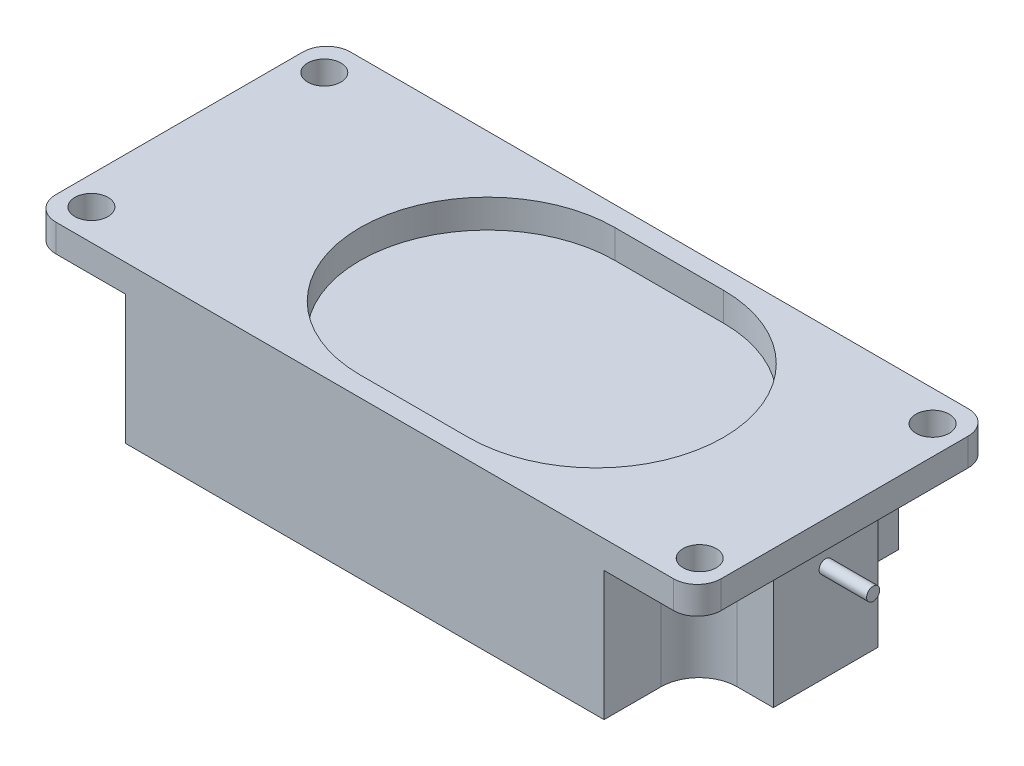
ISO-10303-21;
HEADER;
FILE_DESCRIPTION(('STEP AP214'),'2;1');
FILE_NAME('part.step','',(''),(''),'','','');
FILE_SCHEMA(('AUTOMOTIVE_DESIGN { 1 0 10303 214 1 1 1 1 }'));
ENDSEC;
DATA;
#1=APPLICATION_CONTEXT('core data for automotive mechanical design processes');
#2=APPLICATION_PROTOCOL_DEFINITION('international standard','automotive_design',2000,#1);
#3=PRODUCT_CONTEXT('',#1,'mechanical');
#4=PRODUCT('Part','Part','',(#3));
#5=PRODUCT_RELATED_PRODUCT_CATEGORY('part','',(#4));
#6=PRODUCT_DEFINITION_FORMATION('','',#4);
#7=PRODUCT_DEFINITION_CONTEXT('part definition',#1,'design');
#8=PRODUCT_DEFINITION('design','',#6,#7);
#9=PRODUCT_DEFINITION_SHAPE('','',#8);
#10=(LENGTH_UNIT() NAMED_UNIT(*) SI_UNIT(.MILLI.,.METRE.));
#11=(NAMED_UNIT(*) PLANE_ANGLE_UNIT() SI_UNIT($,.RADIAN.));
#12=(NAMED_UNIT(*) SI_UNIT($,.STERADIAN.) SOLID_ANGLE_UNIT());
#13=UNCERTAINTY_MEASURE_WITH_UNIT(LENGTH_MEASURE(1.E-05),#10,'distance_accuracy_value','');
#14=(GEOMETRIC_REPRESENTATION_CONTEXT(3) GLOBAL_UNCERTAINTY_ASSIGNED_CONTEXT((#13)) GLOBAL_UNIT_ASSIGNED_CONTEXT((#10,
#11,#12)) REPRESENTATION_CONTEXT('',''));
#15=CARTESIAN_POINT('',(0.,0.,0.));
#16=DIRECTION('',(0.,0.,1.));
#17=DIRECTION('',(1.,0.,0.));
#18=AXIS2_PLACEMENT_3D('',#15,#16,#17);
#19=CARTESIAN_POINT('',(0.,0.,0.));
#20=DIRECTION('',(0.,-1.,0.));
#21=DIRECTION('',(0.,0.,-1.));
#22=AXIS2_PLACEMENT_3D('',#19,#20,#21);
#23=PLANE('',#22);
#24=DIRECTION('',(1.,0.,0.));
#25=VECTOR('',#24,1.);
#26=CARTESIAN_POINT('',(25.185,0.,-5.5));
#27=LINE('',#26,#25);
#28=CARTESIAN_POINT('',(29.185,0.,-5.5));
#29=VERTEX_POINT('',#28);
#30=CARTESIAN_POINT('',(33.,0.,-5.5));
#31=VERTEX_POINT('',#30);
#32=EDGE_CURVE('E307',#29,#31,#27,.T.);
#33=ORIENTED_EDGE('',*,*,#32,.F.);
#34=CARTESIAN_POINT('',(29.185,0.,-9.5));
#35=DIRECTION('',(0.,-1.,0.));
#36=DIRECTION('',(0.,0.,-1.));
#37=AXIS2_PLACEMENT_3D('',#34,#35,#36);
#38=CIRCLE('',#37,4.);
#39=CARTESIAN_POINT('',(25.185,0.,-9.5));
#40=VERTEX_POINT('',#39);
#41=EDGE_CURVE('E443',#29,#40,#38,.T.);
#42=ORIENTED_EDGE('',*,*,#41,.T.);
#43=DIRECTION('',(0.,0.,1.));
#44=VECTOR('',#43,1.);
#45=CARTESIAN_POINT('',(25.185,0.,-15.5));
#46=LINE('',#45,#44);
#47=CARTESIAN_POINT('',(25.185,0.,-15.5));
#48=VERTEX_POINT('',#47);
#49=EDGE_CURVE('E304',#48,#40,#46,.T.);
#50=ORIENTED_EDGE('',*,*,#49,.F.);
#51=DIRECTION('',(-1.,0.,0.));
#52=VECTOR('',#51,1.);
#53=CARTESIAN_POINT('',(35.,0.,-15.5));
#54=LINE('',#53,#52);
#55=CARTESIAN_POINT('',(32.5,0.,-15.5));
#56=VERTEX_POINT('',#55);
#57=EDGE_CURVE('E365',#56,#48,#54,.T.);
#58=ORIENTED_EDGE('',*,*,#57,.F.);
#59=CARTESIAN_POINT('',(32.5,0.,-13.));
#60=DIRECTION('',(0.,-1.,0.));
#61=DIRECTION('',(0.,0.,-1.));
#62=AXIS2_PLACEMENT_3D('',#59,#60,#61);
#63=CIRCLE('',#62,2.5);
#64=CARTESIAN_POINT('',(35.,0.,-13.));
#65=VERTEX_POINT('',#64);
#66=EDGE_CURVE('E396',#56,#65,#63,.T.);
#67=ORIENTED_EDGE('',*,*,#66,.T.);
#68=DIRECTION('',(0.,0.,-1.));
#69=VECTOR('',#68,1.);
#70=CARTESIAN_POINT('',(35.,0.,-15.5));
#71=LINE('',#70,#69);
#72=CARTESIAN_POINT('',(35.,0.,13.));
#73=VERTEX_POINT('',#72);
#74=EDGE_CURVE('E381',#73,#65,#71,.T.);
#75=ORIENTED_EDGE('',*,*,#74,.F.);
#76=CARTESIAN_POINT('',(32.5,0.,13.));
#77=DIRECTION('',(0.,-1.,0.));
#78=DIRECTION('',(0.,0.,-1.));
#79=AXIS2_PLACEMENT_3D('',#76,#77,#78);
#80=CIRCLE('',#79,2.5);
#81=CARTESIAN_POINT('',(32.5,0.,15.5));
#82=VERTEX_POINT('',#81);
#83=EDGE_CURVE('E393',#73,#82,#80,.T.);
#84=ORIENTED_EDGE('',*,*,#83,.T.);
#85=DIRECTION('',(1.,0.,0.));
#86=VECTOR('',#85,1.);
#87=CARTESIAN_POINT('',(35.,0.,15.5));
#88=LINE('',#87,#86);
#89=CARTESIAN_POINT('',(25.185,0.,15.5));
#90=VERTEX_POINT('',#89);
#91=EDGE_CURVE('E377',#90,#82,#88,.T.);
#92=ORIENTED_EDGE('',*,*,#91,.F.);
#93=DIRECTION('',(0.,0.,1.));
#94=VECTOR('',#93,1.);
#95=CARTESIAN_POINT('',(25.185,0.,5.5));
#96=LINE('',#95,#94);
#97=CARTESIAN_POINT('',(25.185,0.,9.5));
#98=VERTEX_POINT('',#97);
#99=EDGE_CURVE('E257',#98,#90,#96,.T.);
#100=ORIENTED_EDGE('',*,*,#99,.F.);
#101=CARTESIAN_POINT('',(29.185,0.,9.5));
#102=DIRECTION('',(0.,-1.,0.));
#103=DIRECTION('',(0.,0.,-1.));
#104=AXIS2_PLACEMENT_3D('',#101,#102,#103);
#105=CIRCLE('',#104,4.);
#106=CARTESIAN_POINT('',(29.185,0.,5.5));
#107=VERTEX_POINT('',#106);
#108=EDGE_CURVE('E441',#98,#107,#105,.T.);
#109=ORIENTED_EDGE('',*,*,#108,.T.);
#110=DIRECTION('',(-1.,0.,0.));
#111=VECTOR('',#110,1.);
#112=CARTESIAN_POINT('',(25.185,0.,5.5));
#113=LINE('',#112,#111);
#114=CARTESIAN_POINT('',(33.,0.,5.5));
#115=VERTEX_POINT('',#114);
#116=EDGE_CURVE('E264',#115,#107,#113,.T.);
#117=ORIENTED_EDGE('',*,*,#116,.F.);
#118=DIRECTION('',(0.,0.,1.));
#119=VECTOR('',#118,1.);
#120=CARTESIAN_POINT('',(33.,0.,-5.5));
#121=LINE('',#120,#119);
#122=EDGE_CURVE('E309',#31,#115,#121,.T.);
#123=ORIENTED_EDGE('',*,*,#122,.F.);
#124=EDGE_LOOP('',(#33,#42,#50,#58,#67,#75,#84,#92,#100,#109,#117,#123));
#125=FACE_BOUND('',#124,.T.);
#126=CARTESIAN_POINT('',(32.,0.,-12.25));
#127=DIRECTION('',(0.,1.,0.));
#128=DIRECTION('',(0.,0.,1.));
#129=AXIS2_PLACEMENT_3D('',#126,#127,#128);
#130=CIRCLE('',#129,1.75);
#131=CARTESIAN_POINT('',(32.,0.,-10.5));
#132=VERTEX_POINT('',#131);
#133=EDGE_CURVE('E336',#132,#132,#130,.T.);
#134=ORIENTED_EDGE('',*,*,#133,.T.);
#135=EDGE_LOOP('',(#134));
#136=FACE_BOUND('',#135,.T.);
#137=CARTESIAN_POINT('',(32.,0.,12.25));
#138=DIRECTION('',(0.,1.,0.));
#139=DIRECTION('',(0.,0.,1.));
#140=AXIS2_PLACEMENT_3D('',#137,#138,#139);
#141=CIRCLE('',#140,1.75);
#142=CARTESIAN_POINT('',(32.,0.,14.));
#143=VERTEX_POINT('',#142);
#144=EDGE_CURVE('E340',#143,#143,#141,.T.);
#145=ORIENTED_EDGE('',*,*,#144,.T.);
#146=EDGE_LOOP('',(#145));
#147=FACE_BOUND('',#146,.T.);
#148=ADVANCED_FACE('F33',(#125,#136,#147),#23,.T.);
#149=CARTESIAN_POINT('',(0.,2.9,0.));
#150=DIRECTION('',(0.,-1.,0.));
#151=DIRECTION('',(0.,0.,-1.));
#152=AXIS2_PLACEMENT_3D('',#149,#150,#151);
#153=PLANE('',#152);
#154=DIRECTION('',(1.,0.,0.));
#155=VECTOR('',#154,1.);
#156=CARTESIAN_POINT('',(-2.575,2.9,13.415));
#157=LINE('',#156,#155);
#158=CARTESIAN_POINT('',(-2.575,2.9,13.415));
#159=VERTEX_POINT('',#158);
#160=CARTESIAN_POINT('',(8.83500000000001,2.9,13.415));
#161=VERTEX_POINT('',#160);
#162=EDGE_CURVE('E251',#159,#161,#157,.T.);
#163=ORIENTED_EDGE('',*,*,#162,.F.);
#164=CARTESIAN_POINT('',(-2.575,2.9,0.));
#165=DIRECTION('',(0.,1.,0.));
#166=DIRECTION('',(0.,0.,1.));
#167=AXIS2_PLACEMENT_3D('',#164,#165,#166);
#168=CIRCLE('',#167,13.415);
#169=CARTESIAN_POINT('',(-2.575,2.9,-13.415));
#170=VERTEX_POINT('',#169);
#171=EDGE_CURVE('E48',#170,#159,#168,.T.);
#172=ORIENTED_EDGE('',*,*,#171,.F.);
#173=DIRECTION('',(-1.,0.,0.));
#174=VECTOR('',#173,1.);
#175=CARTESIAN_POINT('',(-2.575,2.9,-13.415));
#176=LINE('',#175,#174);
#177=CARTESIAN_POINT('',(8.83500000000001,2.9,-13.415));
#178=VERTEX_POINT('',#177);
#179=EDGE_CURVE('E240',#178,#170,#176,.T.);
#180=ORIENTED_EDGE('',*,*,#179,.F.);
#181=CARTESIAN_POINT('',(8.83500000000001,2.9,0.));
#182=DIRECTION('',(0.,1.,0.));
#183=DIRECTION('',(0.,0.,1.));
#184=AXIS2_PLACEMENT_3D('',#181,#182,#183);
#185=CIRCLE('',#184,13.415);
#186=EDGE_CURVE('E243',#161,#178,#185,.T.);
#187=ORIENTED_EDGE('',*,*,#186,.F.);
#188=EDGE_LOOP('',(#163,#172,#180,#187));
#189=FACE_BOUND('',#188,.T.);
#190=DIRECTION('',(-1.,0.,0.));
#191=VECTOR('',#190,1.);
#192=CARTESIAN_POINT('',(35.,2.9,-15.5));
#193=LINE('',#192,#191);
#194=CARTESIAN_POINT('',(32.5,2.9,-15.5));
#195=VERTEX_POINT('',#194);
#196=CARTESIAN_POINT('',(-32.5,2.9,-15.5));
#197=VERTEX_POINT('',#196);
#198=EDGE_CURVE('E371',#195,#197,#193,.T.);
#199=ORIENTED_EDGE('',*,*,#198,.T.);
#200=CARTESIAN_POINT('',(-32.5,2.9,-13.));
#201=DIRECTION('',(0.,-1.,0.));
#202=DIRECTION('',(0.,0.,-1.));
#203=AXIS2_PLACEMENT_3D('',#200,#201,#202);
#204=CIRCLE('',#203,2.5);
#205=CARTESIAN_POINT('',(-35.,2.9,-13.));
#206=VERTEX_POINT('',#205);
#207=EDGE_CURVE('E412',#197,#206,#204,.F.);
#208=ORIENTED_EDGE('',*,*,#207,.T.);
#209=DIRECTION('',(0.,0.,1.));
#210=VECTOR('',#209,1.);
#211=CARTESIAN_POINT('',(-35.,2.9,-15.5));
#212=LINE('',#211,#210);
#213=CARTESIAN_POINT('',(-35.,2.9,13.));
#214=VERTEX_POINT('',#213);
#215=EDGE_CURVE('E361',#206,#214,#212,.T.);
#216=ORIENTED_EDGE('',*,*,#215,.T.);
#217=CARTESIAN_POINT('',(-32.5,2.9,13.));
#218=DIRECTION('',(0.,-1.,0.));
#219=DIRECTION('',(0.,0.,-1.));
#220=AXIS2_PLACEMENT_3D('',#217,#218,#219);
#221=CIRCLE('',#220,2.5);
#222=CARTESIAN_POINT('',(-32.5,2.9,15.5));
#223=VERTEX_POINT('',#222);
#224=EDGE_CURVE('E406',#214,#223,#221,.F.);
#225=ORIENTED_EDGE('',*,*,#224,.T.);
#226=DIRECTION('',(1.,0.,0.));
#227=VECTOR('',#226,1.);
#228=CARTESIAN_POINT('',(35.,2.9,15.5));
#229=LINE('',#228,#227);
#230=CARTESIAN_POINT('',(32.5,2.9,15.5));
#231=VERTEX_POINT('',#230);
#232=EDGE_CURVE('E364',#223,#231,#229,.T.);
#233=ORIENTED_EDGE('',*,*,#232,.T.);
#234=CARTESIAN_POINT('',(32.5,2.9,13.));
#235=DIRECTION('',(0.,-1.,0.));
#236=DIRECTION('',(0.,0.,-1.));
#237=AXIS2_PLACEMENT_3D('',#234,#235,#236);
#238=CIRCLE('',#237,2.5);
#239=CARTESIAN_POINT('',(35.,2.9,13.));
#240=VERTEX_POINT('',#239);
#241=EDGE_CURVE('E408',#231,#240,#238,.F.);
#242=ORIENTED_EDGE('',*,*,#241,.T.);
#243=DIRECTION('',(0.,0.,-1.));
#244=VECTOR('',#243,1.);
#245=CARTESIAN_POINT('',(35.,2.9,-15.5));
#246=LINE('',#245,#244);
#247=CARTESIAN_POINT('',(35.,2.9,-13.));
#248=VERTEX_POINT('',#247);
#249=EDGE_CURVE('E368',#240,#248,#246,.T.);
#250=ORIENTED_EDGE('',*,*,#249,.T.);
#251=CARTESIAN_POINT('',(32.5,2.9,-13.));
#252=DIRECTION('',(0.,-1.,0.));
#253=DIRECTION('',(0.,0.,-1.));
#254=AXIS2_PLACEMENT_3D('',#251,#252,#253);
#255=CIRCLE('',#254,2.5);
#256=EDGE_CURVE('E410',#248,#195,#255,.F.);
#257=ORIENTED_EDGE('',*,*,#256,.T.);
#258=EDGE_LOOP('',(#199,#208,#216,#225,#233,#242,#250,#257));
#259=FACE_BOUND('',#258,.T.);
#260=CARTESIAN_POINT('',(-32.,2.9,-12.25));
#261=DIRECTION('',(0.,1.,0.));
#262=DIRECTION('',(0.,0.,1.));
#263=AXIS2_PLACEMENT_3D('',#260,#261,#262);
#264=CIRCLE('',#263,1.75);
#265=CARTESIAN_POINT('',(-32.,2.9,-10.5));
#266=VERTEX_POINT('',#265);
#267=EDGE_CURVE('E355',#266,#266,#264,.T.);
#268=ORIENTED_EDGE('',*,*,#267,.F.);
#269=EDGE_LOOP('',(#268));
#270=FACE_BOUND('',#269,.T.);
#271=CARTESIAN_POINT('',(-32.,2.9,12.25));
#272=DIRECTION('',(0.,1.,0.));
#273=DIRECTION('',(0.,0.,1.));
#274=AXIS2_PLACEMENT_3D('',#271,#272,#273);
#275=CIRCLE('',#274,1.75);
#276=CARTESIAN_POINT('',(-32.,2.9,14.));
#277=VERTEX_POINT('',#276);
#278=EDGE_CURVE('E349',#277,#277,#275,.T.);
#279=ORIENTED_EDGE('',*,*,#278,.F.);
#280=EDGE_LOOP('',(#279));
#281=FACE_BOUND('',#280,.T.);
#282=CARTESIAN_POINT('',(32.,2.9,12.25));
#283=DIRECTION('',(0.,1.,0.));
#284=DIRECTION('',(0.,0.,1.));
#285=AXIS2_PLACEMENT_3D('',#282,#283,#284);
#286=CIRCLE('',#285,1.75);
#287=CARTESIAN_POINT('',(32.,2.9,14.));
#288=VERTEX_POINT('',#287);
#289=EDGE_CURVE('E343',#288,#288,#286,.T.);
#290=ORIENTED_EDGE('',*,*,#289,.F.);
#291=EDGE_LOOP('',(#290));
#292=FACE_BOUND('',#291,.T.);
#293=CARTESIAN_POINT('',(32.,2.9,-12.25));
#294=DIRECTION('',(0.,1.,0.));
#295=DIRECTION('',(0.,0.,1.));
#296=AXIS2_PLACEMENT_3D('',#293,#294,#295);
#297=CIRCLE('',#296,1.75);
#298=CARTESIAN_POINT('',(32.,2.9,-10.5));
#299=VERTEX_POINT('',#298);
#300=EDGE_CURVE('E337',#299,#299,#297,.T.);
#301=ORIENTED_EDGE('',*,*,#300,.F.);
#302=EDGE_LOOP('',(#301));
#303=FACE_BOUND('',#302,.T.);
#304=ADVANCED_FACE('F508',(#189,#259,#270,#281,#292,#303),#153,.F.);
#305=DIRECTION('',(-1.,0.,0.));
#306=VECTOR('',#305,1.);
#307=CARTESIAN_POINT('',(-33.,0.,5.5));
#308=LINE('',#307,#306);
#309=CARTESIAN_POINT('',(-29.185,0.,5.5));
#310=VERTEX_POINT('',#309);
#311=CARTESIAN_POINT('',(-33.,0.,5.5));
#312=VERTEX_POINT('',#311);
#313=EDGE_CURVE('E294',#310,#312,#308,.T.);
#314=ORIENTED_EDGE('',*,*,#313,.F.);
#315=CARTESIAN_POINT('',(-29.185,0.,9.5));
#316=DIRECTION('',(0.,-1.,0.));
#317=DIRECTION('',(0.,0.,-1.));
#318=AXIS2_PLACEMENT_3D('',#315,#316,#317);
#319=CIRCLE('',#318,4.);
#320=CARTESIAN_POINT('',(-25.185,0.,9.5));
#321=VERTEX_POINT('',#320);
#322=EDGE_CURVE('E429',#310,#321,#319,.T.);
#323=ORIENTED_EDGE('',*,*,#322,.T.);
#324=DIRECTION('',(0.,0.,-1.));
#325=VECTOR('',#324,1.);
#326=CARTESIAN_POINT('',(-25.185,0.,5.5));
#327=LINE('',#326,#325);
#328=CARTESIAN_POINT('',(-25.185,0.,15.5));
#329=VERTEX_POINT('',#328);
#330=EDGE_CURVE('E291',#329,#321,#327,.T.);
#331=ORIENTED_EDGE('',*,*,#330,.F.);
#332=CARTESIAN_POINT('',(-32.5,0.,15.5));
#333=VERTEX_POINT('',#332);
#334=EDGE_CURVE('E378',#333,#329,#88,.T.);
#335=ORIENTED_EDGE('',*,*,#334,.F.);
#336=CARTESIAN_POINT('',(-32.5,0.,13.));
#337=DIRECTION('',(0.,-1.,0.));
#338=DIRECTION('',(0.,0.,-1.));
#339=AXIS2_PLACEMENT_3D('',#336,#337,#338);
#340=CIRCLE('',#339,2.5);
#341=CARTESIAN_POINT('',(-35.,0.,13.));
#342=VERTEX_POINT('',#341);
#343=EDGE_CURVE('E391',#333,#342,#340,.T.);
#344=ORIENTED_EDGE('',*,*,#343,.T.);
#345=DIRECTION('',(0.,0.,1.));
#346=VECTOR('',#345,1.);
#347=CARTESIAN_POINT('',(-35.,0.,-15.5));
#348=LINE('',#347,#346);
#349=CARTESIAN_POINT('',(-35.,0.,-13.));
#350=VERTEX_POINT('',#349);
#351=EDGE_CURVE('E358',#350,#342,#348,.T.);
#352=ORIENTED_EDGE('',*,*,#351,.F.);
#353=CARTESIAN_POINT('',(-32.5,0.,-13.));
#354=DIRECTION('',(0.,-1.,0.));
#355=DIRECTION('',(0.,0.,-1.));
#356=AXIS2_PLACEMENT_3D('',#353,#354,#355);
#357=CIRCLE('',#356,2.5);
#358=CARTESIAN_POINT('',(-32.5,0.,-15.5));
#359=VERTEX_POINT('',#358);
#360=EDGE_CURVE('E398',#350,#359,#357,.T.);
#361=ORIENTED_EDGE('',*,*,#360,.T.);
#362=CARTESIAN_POINT('',(-25.185,0.,-15.5));
#363=VERTEX_POINT('',#362);
#364=EDGE_CURVE('E384',#363,#359,#54,.T.);
#365=ORIENTED_EDGE('',*,*,#364,.F.);
#366=DIRECTION('',(0.,0.,-1.));
#367=VECTOR('',#366,1.);
#368=CARTESIAN_POINT('',(-25.185,0.,-15.5));
#369=LINE('',#368,#367);
#370=CARTESIAN_POINT('',(-25.185,0.,-9.5));
#371=VERTEX_POINT('',#370);
#372=EDGE_CURVE('E302',#371,#363,#369,.T.);
#373=ORIENTED_EDGE('',*,*,#372,.F.);
#374=CARTESIAN_POINT('',(-29.185,0.,-9.5));
#375=DIRECTION('',(0.,-1.,0.));
#376=DIRECTION('',(0.,0.,-1.));
#377=AXIS2_PLACEMENT_3D('',#374,#375,#376);
#378=CIRCLE('',#377,4.);
#379=CARTESIAN_POINT('',(-29.185,0.,-5.5));
#380=VERTEX_POINT('',#379);
#381=EDGE_CURVE('E427',#371,#380,#378,.T.);
#382=ORIENTED_EDGE('',*,*,#381,.T.);
#383=DIRECTION('',(1.,0.,0.));
#384=VECTOR('',#383,1.);
#385=CARTESIAN_POINT('',(-33.,0.,-5.5));
#386=LINE('',#385,#384);
#387=CARTESIAN_POINT('',(-33.,0.,-5.5));
#388=VERTEX_POINT('',#387);
#389=EDGE_CURVE('E299',#388,#380,#386,.T.);
#390=ORIENTED_EDGE('',*,*,#389,.F.);
#391=DIRECTION('',(0.,0.,-1.));
#392=VECTOR('',#391,1.);
#393=CARTESIAN_POINT('',(-33.,0.,-5.5));
#394=LINE('',#393,#392);
#395=EDGE_CURVE('E296',#312,#388,#394,.T.);
#396=ORIENTED_EDGE('',*,*,#395,.F.);
#397=EDGE_LOOP('',(#314,#323,#331,#335,#344,#352,#361,#365,#373,#382,#390,#396));
#398=FACE_BOUND('',#397,.T.);
#399=CARTESIAN_POINT('',(-32.,0.,-12.25));
#400=DIRECTION('',(0.,1.,0.));
#401=DIRECTION('',(0.,0.,1.));
#402=AXIS2_PLACEMENT_3D('',#399,#400,#401);
#403=CIRCLE('',#402,1.75);
#404=CARTESIAN_POINT('',(-32.,0.,-10.5));
#405=VERTEX_POINT('',#404);
#406=EDGE_CURVE('E352',#405,#405,#403,.T.);
#407=ORIENTED_EDGE('',*,*,#406,.T.);
#408=EDGE_LOOP('',(#407));
#409=FACE_BOUND('',#408,.T.);
#410=CARTESIAN_POINT('',(-32.,0.,12.25));
#411=DIRECTION('',(0.,1.,0.));
#412=DIRECTION('',(0.,0.,1.));
#413=AXIS2_PLACEMENT_3D('',#410,#411,#412);
#414=CIRCLE('',#413,1.75);
#415=CARTESIAN_POINT('',(-32.,0.,14.));
#416=VERTEX_POINT('',#415);
#417=EDGE_CURVE('E346',#416,#416,#414,.T.);
#418=ORIENTED_EDGE('',*,*,#417,.T.);
#419=EDGE_LOOP('',(#418));
#420=FACE_BOUND('',#419,.T.);
#421=ADVANCED_FACE('F548',(#398,#409,#420),#23,.T.);
#422=CARTESIAN_POINT('',(-35.,2.9,-15.5));
#423=DIRECTION('',(1.,0.,0.));
#424=DIRECTION('',(0.,0.,-1.));
#425=AXIS2_PLACEMENT_3D('',#422,#423,#424);
#426=PLANE('',#425);
#427=ORIENTED_EDGE('',*,*,#215,.F.);
#428=DIRECTION('',(0.,-1.,0.));
#429=VECTOR('',#428,1.);
#430=CARTESIAN_POINT('',(-35.,2.9,-13.));
#431=LINE('',#430,#429);
#432=EDGE_CURVE('E388',#206,#350,#431,.T.);
#433=ORIENTED_EDGE('',*,*,#432,.T.);
#434=ORIENTED_EDGE('',*,*,#351,.T.);
#435=DIRECTION('',(0.,-1.,0.));
#436=VECTOR('',#435,1.);
#437=CARTESIAN_POINT('',(-35.,2.9,13.));
#438=LINE('',#437,#436);
#439=EDGE_CURVE('E374',#342,#214,#438,.F.);
#440=ORIENTED_EDGE('',*,*,#439,.T.);
#441=EDGE_LOOP('',(#427,#433,#434,#440));
#442=FACE_BOUND('',#441,.T.);
#443=ADVANCED_FACE('F519',(#442),#426,.F.);
#444=CARTESIAN_POINT('',(35.,2.9,15.5));
#445=DIRECTION('',(0.,0.,-1.));
#446=DIRECTION('',(-1.,0.,0.));
#447=AXIS2_PLACEMENT_3D('',#444,#445,#446);
#448=PLANE('',#447);
#449=ORIENTED_EDGE('',*,*,#334,.T.);
#450=DIRECTION('',(0.,1.,0.));
#451=VECTOR('',#450,1.);
#452=CARTESIAN_POINT('',(-25.185,-13.6,15.5));
#453=LINE('',#452,#451);
#454=CARTESIAN_POINT('',(-25.185,-13.6,15.5));
#455=VERTEX_POINT('',#454);
#456=EDGE_CURVE('E330',#455,#329,#453,.T.);
#457=ORIENTED_EDGE('',*,*,#456,.F.);
#458=DIRECTION('',(-1.,0.,0.));
#459=VECTOR('',#458,1.);
#460=CARTESIAN_POINT('',(-25.185,-13.6,15.5));
#461=LINE('',#460,#459);
#462=CARTESIAN_POINT('',(25.185,-13.6,15.5));
#463=VERTEX_POINT('',#462);
#464=EDGE_CURVE('E263',#463,#455,#461,.T.);
#465=ORIENTED_EDGE('',*,*,#464,.F.);
#466=DIRECTION('',(0.,1.,0.));
#467=VECTOR('',#466,1.);
#468=CARTESIAN_POINT('',(25.185,-13.6,15.5));
#469=LINE('',#468,#467);
#470=EDGE_CURVE('E333',#463,#90,#469,.T.);
#471=ORIENTED_EDGE('',*,*,#470,.T.);
#472=ORIENTED_EDGE('',*,*,#91,.T.);
#473=DIRECTION('',(0.,-1.,0.));
#474=VECTOR('',#473,1.);
#475=CARTESIAN_POINT('',(32.5,2.9,15.5));
#476=LINE('',#475,#474);
#477=EDGE_CURVE('E422',#82,#231,#476,.F.);
#478=ORIENTED_EDGE('',*,*,#477,.T.);
#479=ORIENTED_EDGE('',*,*,#232,.F.);
#480=DIRECTION('',(0.,-1.,0.));
#481=VECTOR('',#480,1.);
#482=CARTESIAN_POINT('',(-32.5,2.9,15.5));
#483=LINE('',#482,#481);
#484=EDGE_CURVE('E419',#223,#333,#483,.T.);
#485=ORIENTED_EDGE('',*,*,#484,.T.);
#486=EDGE_LOOP('',(#449,#457,#465,#471,#472,#478,#479,#485));
#487=FACE_BOUND('',#486,.T.);
#488=ADVANCED_FACE('F528',(#487),#448,.F.);
#489=CARTESIAN_POINT('',(35.,2.9,-15.5));
#490=DIRECTION('',(-1.,0.,0.));
#491=DIRECTION('',(0.,0.,1.));
#492=AXIS2_PLACEMENT_3D('',#489,#490,#491);
#493=PLANE('',#492);
#494=ORIENTED_EDGE('',*,*,#74,.T.);
#495=DIRECTION('',(0.,-1.,0.));
#496=VECTOR('',#495,1.);
#497=CARTESIAN_POINT('',(35.,2.9,-13.));
#498=LINE('',#497,#496);
#499=EDGE_CURVE('E417',#65,#248,#498,.F.);
#500=ORIENTED_EDGE('',*,*,#499,.T.);
#501=ORIENTED_EDGE('',*,*,#249,.F.);
#502=DIRECTION('',(0.,-1.,0.));
#503=VECTOR('',#502,1.);
#504=CARTESIAN_POINT('',(35.,2.9,13.));
#505=LINE('',#504,#503);
#506=EDGE_CURVE('E414',#240,#73,#505,.T.);
#507=ORIENTED_EDGE('',*,*,#506,.T.);
#508=EDGE_LOOP('',(#494,#500,#501,#507));
#509=FACE_BOUND('',#508,.T.);
#510=ADVANCED_FACE('F502',(#509),#493,.F.);
#511=CARTESIAN_POINT('',(35.,2.9,-15.5));
#512=DIRECTION('',(0.,0.,1.));
#513=DIRECTION('',(1.,0.,0.));
#514=AXIS2_PLACEMENT_3D('',#511,#512,#513);
#515=PLANE('',#514);
#516=ORIENTED_EDGE('',*,*,#57,.T.);
#517=DIRECTION('',(0.,1.,0.));
#518=VECTOR('',#517,1.);
#519=CARTESIAN_POINT('',(25.185,-13.6,-15.5));
#520=LINE('',#519,#518);
#521=CARTESIAN_POINT('',(25.185,-13.6,-15.5));
#522=VERTEX_POINT('',#521);
#523=EDGE_CURVE('E318',#522,#48,#520,.T.);
#524=ORIENTED_EDGE('',*,*,#523,.F.);
#525=DIRECTION('',(1.,0.,0.));
#526=VECTOR('',#525,1.);
#527=CARTESIAN_POINT('',(-25.185,-13.6,-15.5));
#528=LINE('',#527,#526);
#529=CARTESIAN_POINT('',(-25.185,-13.6,-15.5));
#530=VERTEX_POINT('',#529);
#531=EDGE_CURVE('E278',#530,#522,#528,.T.);
#532=ORIENTED_EDGE('',*,*,#531,.F.);
#533=DIRECTION('',(0.,1.,0.));
#534=VECTOR('',#533,1.);
#535=CARTESIAN_POINT('',(-25.185,-13.6,-15.5));
#536=LINE('',#535,#534);
#537=EDGE_CURVE('E321',#530,#363,#536,.T.);
#538=ORIENTED_EDGE('',*,*,#537,.T.);
#539=ORIENTED_EDGE('',*,*,#364,.T.);
#540=DIRECTION('',(0.,-1.,0.));
#541=VECTOR('',#540,1.);
#542=CARTESIAN_POINT('',(-32.5,2.9,-15.5));
#543=LINE('',#542,#541);
#544=EDGE_CURVE('E404',#359,#197,#543,.F.);
#545=ORIENTED_EDGE('',*,*,#544,.T.);
#546=ORIENTED_EDGE('',*,*,#198,.F.);
#547=DIRECTION('',(0.,-1.,0.));
#548=VECTOR('',#547,1.);
#549=CARTESIAN_POINT('',(32.5,2.9,-15.5));
#550=LINE('',#549,#548);
#551=EDGE_CURVE('E401',#195,#56,#550,.T.);
#552=ORIENTED_EDGE('',*,*,#551,.T.);
#553=EDGE_LOOP('',(#516,#524,#532,#538,#539,#545,#546,#552));
#554=FACE_BOUND('',#553,.T.);
#555=ADVANCED_FACE('F494',(#554),#515,.F.);
#556=CARTESIAN_POINT('',(-32.,2.9,-12.25));
#557=DIRECTION('',(0.,-1.,0.));
#558=DIRECTION('',(0.,0.,-1.));
#559=AXIS2_PLACEMENT_3D('',#556,#557,#558);
#560=CYLINDRICAL_SURFACE('',#559,1.75);
#561=ORIENTED_EDGE('',*,*,#267,.T.);
#562=EDGE_LOOP('',(#561));
#563=FACE_BOUND('',#562,.T.);
#564=ORIENTED_EDGE('',*,*,#406,.F.);
#565=EDGE_LOOP('',(#564));
#566=FACE_BOUND('',#565,.T.);
#567=ADVANCED_FACE('F788',(#563,#566),#560,.F.);
#568=CARTESIAN_POINT('',(-32.,2.9,12.25));
#569=DIRECTION('',(0.,-1.,0.));
#570=DIRECTION('',(0.,0.,-1.));
#571=AXIS2_PLACEMENT_3D('',#568,#569,#570);
#572=CYLINDRICAL_SURFACE('',#571,1.75);
#573=ORIENTED_EDGE('',*,*,#278,.T.);
#574=EDGE_LOOP('',(#573));
#575=FACE_BOUND('',#574,.T.);
#576=ORIENTED_EDGE('',*,*,#417,.F.);
#577=EDGE_LOOP('',(#576));
#578=FACE_BOUND('',#577,.T.);
#579=ADVANCED_FACE('F797',(#575,#578),#572,.F.);
#580=CARTESIAN_POINT('',(32.,2.9,12.25));
#581=DIRECTION('',(0.,-1.,0.));
#582=DIRECTION('',(0.,0.,-1.));
#583=AXIS2_PLACEMENT_3D('',#580,#581,#582);
#584=CYLINDRICAL_SURFACE('',#583,1.75);
#585=ORIENTED_EDGE('',*,*,#289,.T.);
#586=EDGE_LOOP('',(#585));
#587=FACE_BOUND('',#586,.T.);
#588=ORIENTED_EDGE('',*,*,#144,.F.);
#589=EDGE_LOOP('',(#588));
#590=FACE_BOUND('',#589,.T.);
#591=ADVANCED_FACE('F806',(#587,#590),#584,.F.);
#592=CARTESIAN_POINT('',(32.,2.9,-12.25));
#593=DIRECTION('',(0.,-1.,0.));
#594=DIRECTION('',(0.,0.,-1.));
#595=AXIS2_PLACEMENT_3D('',#592,#593,#594);
#596=CYLINDRICAL_SURFACE('',#595,1.75);
#597=ORIENTED_EDGE('',*,*,#300,.T.);
#598=EDGE_LOOP('',(#597));
#599=FACE_BOUND('',#598,.T.);
#600=ORIENTED_EDGE('',*,*,#133,.F.);
#601=EDGE_LOOP('',(#600));
#602=FACE_BOUND('',#601,.T.);
#603=ADVANCED_FACE('F594',(#599,#602),#596,.F.);
#604=CARTESIAN_POINT('',(-32.5,2.9,-13.));
#605=DIRECTION('',(0.,-1.,0.));
#606=DIRECTION('',(0.,0.,-1.));
#607=AXIS2_PLACEMENT_3D('',#604,#605,#606);
#608=CYLINDRICAL_SURFACE('',#607,2.5);
#609=ORIENTED_EDGE('',*,*,#207,.F.);
#610=ORIENTED_EDGE('',*,*,#544,.F.);
#611=ORIENTED_EDGE('',*,*,#360,.F.);
#612=ORIENTED_EDGE('',*,*,#432,.F.);
#613=EDGE_LOOP('',(#609,#610,#611,#612));
#614=FACE_BOUND('',#613,.T.);
#615=ADVANCED_FACE('F514',(#614),#608,.T.);
#616=CARTESIAN_POINT('',(32.5,2.9,-13.));
#617=DIRECTION('',(0.,-1.,0.));
#618=DIRECTION('',(0.,0.,-1.));
#619=AXIS2_PLACEMENT_3D('',#616,#617,#618);
#620=CYLINDRICAL_SURFACE('',#619,2.5);
#621=ORIENTED_EDGE('',*,*,#256,.F.);
#622=ORIENTED_EDGE('',*,*,#499,.F.);
#623=ORIENTED_EDGE('',*,*,#66,.F.);
#624=ORIENTED_EDGE('',*,*,#551,.F.);
#625=EDGE_LOOP('',(#621,#622,#623,#624));
#626=FACE_BOUND('',#625,.T.);
#627=ADVANCED_FACE('F506',(#626),#620,.T.);
#628=CARTESIAN_POINT('',(32.5,2.9,13.));
#629=DIRECTION('',(0.,-1.,0.));
#630=DIRECTION('',(0.,0.,-1.));
#631=AXIS2_PLACEMENT_3D('',#628,#629,#630);
#632=CYLINDRICAL_SURFACE('',#631,2.5);
#633=ORIENTED_EDGE('',*,*,#241,.F.);
#634=ORIENTED_EDGE('',*,*,#477,.F.);
#635=ORIENTED_EDGE('',*,*,#83,.F.);
#636=ORIENTED_EDGE('',*,*,#506,.F.);
#637=EDGE_LOOP('',(#633,#634,#635,#636));
#638=FACE_BOUND('',#637,.T.);
#639=ADVANCED_FACE('F532',(#638),#632,.T.);
#640=CARTESIAN_POINT('',(-32.5,2.9,13.));
#641=DIRECTION('',(0.,-1.,0.));
#642=DIRECTION('',(0.,0.,-1.));
#643=AXIS2_PLACEMENT_3D('',#640,#641,#642);
#644=CYLINDRICAL_SURFACE('',#643,2.5);
#645=ORIENTED_EDGE('',*,*,#224,.F.);
#646=ORIENTED_EDGE('',*,*,#439,.F.);
#647=ORIENTED_EDGE('',*,*,#343,.F.);
#648=ORIENTED_EDGE('',*,*,#484,.F.);
#649=EDGE_LOOP('',(#645,#646,#647,#648));
#650=FACE_BOUND('',#649,.T.);
#651=ADVANCED_FACE('F523',(#650),#644,.T.);
#652=CARTESIAN_POINT('',(25.185,-13.6,5.5));
#653=DIRECTION('',(-1.,0.,0.));
#654=DIRECTION('',(0.,0.,1.));
#655=AXIS2_PLACEMENT_3D('',#652,#653,#654);
#656=PLANE('',#655);
#657=DIRECTION('',(0.,0.,1.));
#658=VECTOR('',#657,1.);
#659=CARTESIAN_POINT('',(25.185,-13.6,5.5));
#660=LINE('',#659,#658);
#661=CARTESIAN_POINT('',(25.185,-13.6,9.5));
#662=VERTEX_POINT('',#661);
#663=EDGE_CURVE('E261',#662,#463,#660,.T.);
#664=ORIENTED_EDGE('',*,*,#663,.F.);
#665=DIRECTION('',(0.,1.,0.));
#666=VECTOR('',#665,1.);
#667=CARTESIAN_POINT('',(25.185,0.,9.5));
#668=LINE('',#667,#666);
#669=EDGE_CURVE('E447',#662,#98,#668,.T.);
#670=ORIENTED_EDGE('',*,*,#669,.T.);
#671=ORIENTED_EDGE('',*,*,#99,.T.);
#672=ORIENTED_EDGE('',*,*,#470,.F.);
#673=EDGE_LOOP('',(#664,#670,#671,#672));
#674=FACE_BOUND('',#673,.T.);
#675=ADVANCED_FACE('F465',(#674),#656,.F.);
#676=CARTESIAN_POINT('',(-25.185,-13.6,5.5));
#677=DIRECTION('',(1.,0.,0.));
#678=DIRECTION('',(0.,0.,-1.));
#679=AXIS2_PLACEMENT_3D('',#676,#677,#678);
#680=PLANE('',#679);
#681=ORIENTED_EDGE('',*,*,#330,.T.);
#682=DIRECTION('',(0.,1.,0.));
#683=VECTOR('',#682,1.);
#684=CARTESIAN_POINT('',(-25.185,-13.6,9.5));
#685=LINE('',#684,#683);
#686=CARTESIAN_POINT('',(-25.185,-13.6,9.5));
#687=VERTEX_POINT('',#686);
#688=EDGE_CURVE('E431',#321,#687,#685,.F.);
#689=ORIENTED_EDGE('',*,*,#688,.T.);
#690=DIRECTION('',(0.,0.,-1.));
#691=VECTOR('',#690,1.);
#692=CARTESIAN_POINT('',(-25.185,-13.6,5.5));
#693=LINE('',#692,#691);
#694=EDGE_CURVE('E266',#455,#687,#693,.T.);
#695=ORIENTED_EDGE('',*,*,#694,.F.);
#696=ORIENTED_EDGE('',*,*,#456,.T.);
#697=EDGE_LOOP('',(#681,#689,#695,#696));
#698=FACE_BOUND('',#697,.T.);
#699=ADVANCED_FACE('F564',(#698),#680,.F.);
#700=CARTESIAN_POINT('',(-33.,-13.6,5.5));
#701=DIRECTION('',(0.,0.,-1.));
#702=DIRECTION('',(-1.,0.,0.));
#703=AXIS2_PLACEMENT_3D('',#700,#701,#702);
#704=PLANE('',#703);
#705=DIRECTION('',(-1.,0.,0.));
#706=VECTOR('',#705,1.);
#707=CARTESIAN_POINT('',(-33.,-13.6,5.5));
#708=LINE('',#707,#706);
#709=CARTESIAN_POINT('',(-29.185,-13.6,5.5));
#710=VERTEX_POINT('',#709);
#711=CARTESIAN_POINT('',(-33.,-13.6,5.5));
#712=VERTEX_POINT('',#711);
#713=EDGE_CURVE('E269',#710,#712,#708,.T.);
#714=ORIENTED_EDGE('',*,*,#713,.F.);
#715=DIRECTION('',(0.,1.,0.));
#716=VECTOR('',#715,1.);
#717=CARTESIAN_POINT('',(-29.185,0.,5.5));
#718=LINE('',#717,#716);
#719=EDGE_CURVE('E424',#710,#310,#718,.T.);
#720=ORIENTED_EDGE('',*,*,#719,.T.);
#721=ORIENTED_EDGE('',*,*,#313,.T.);
#722=DIRECTION('',(0.,1.,0.));
#723=VECTOR('',#722,1.);
#724=CARTESIAN_POINT('',(-33.,-13.6,5.5));
#725=LINE('',#724,#723);
#726=EDGE_CURVE('E327',#712,#312,#725,.T.);
#727=ORIENTED_EDGE('',*,*,#726,.F.);
#728=EDGE_LOOP('',(#714,#720,#721,#727));
#729=FACE_BOUND('',#728,.T.);
#730=ADVANCED_FACE('F544',(#729),#704,.F.);
#731=CARTESIAN_POINT('',(-33.,-13.6,-5.5));
#732=DIRECTION('',(1.,0.,0.));
#733=DIRECTION('',(0.,0.,-1.));
#734=AXIS2_PLACEMENT_3D('',#731,#732,#733);
#735=PLANE('',#734);
#736=ORIENTED_EDGE('',*,*,#395,.T.);
#737=DIRECTION('',(0.,1.,0.));
#738=VECTOR('',#737,1.);
#739=CARTESIAN_POINT('',(-33.,-13.6,-5.5));
#740=LINE('',#739,#738);
#741=CARTESIAN_POINT('',(-33.,-13.6,-5.5));
#742=VERTEX_POINT('',#741);
#743=EDGE_CURVE('E324',#742,#388,#740,.T.);
#744=ORIENTED_EDGE('',*,*,#743,.F.);
#745=DIRECTION('',(0.,0.,-1.));
#746=VECTOR('',#745,1.);
#747=CARTESIAN_POINT('',(-33.,-13.6,-5.5));
#748=LINE('',#747,#746);
#749=EDGE_CURVE('E271',#712,#742,#748,.T.);
#750=ORIENTED_EDGE('',*,*,#749,.F.);
#751=ORIENTED_EDGE('',*,*,#726,.T.);
#752=EDGE_LOOP('',(#736,#744,#750,#751));
#753=FACE_BOUND('',#752,.T.);
#754=ADVANCED_FACE('F553',(#753),#735,.F.);
#755=CARTESIAN_POINT('',(-33.,-13.6,-5.5));
#756=DIRECTION('',(0.,0.,1.));
#757=DIRECTION('',(1.,0.,0.));
#758=AXIS2_PLACEMENT_3D('',#755,#756,#757);
#759=PLANE('',#758);
#760=ORIENTED_EDGE('',*,*,#389,.T.);
#761=DIRECTION('',(0.,1.,0.));
#762=VECTOR('',#761,1.);
#763=CARTESIAN_POINT('',(-29.185,-13.6,-5.5));
#764=LINE('',#763,#762);
#765=CARTESIAN_POINT('',(-29.185,-13.6,-5.5));
#766=VERTEX_POINT('',#765);
#767=EDGE_CURVE('E436',#380,#766,#764,.F.);
#768=ORIENTED_EDGE('',*,*,#767,.T.);
#769=DIRECTION('',(1.,0.,0.));
#770=VECTOR('',#769,1.);
#771=CARTESIAN_POINT('',(-33.,-13.6,-5.5));
#772=LINE('',#771,#770);
#773=EDGE_CURVE('E273',#742,#766,#772,.T.);
#774=ORIENTED_EDGE('',*,*,#773,.F.);
#775=ORIENTED_EDGE('',*,*,#743,.T.);
#776=EDGE_LOOP('',(#760,#768,#774,#775));
#777=FACE_BOUND('',#776,.T.);
#778=ADVANCED_FACE('F635',(#777),#759,.F.);
#779=CARTESIAN_POINT('',(-25.185,-13.6,-15.5));
#780=DIRECTION('',(1.,0.,0.));
#781=DIRECTION('',(0.,0.,-1.));
#782=AXIS2_PLACEMENT_3D('',#779,#780,#781);
#783=PLANE('',#782);
#784=DIRECTION('',(0.,0.,-1.));
#785=VECTOR('',#784,1.);
#786=CARTESIAN_POINT('',(-25.185,-13.6,-15.5));
#787=LINE('',#786,#785);
#788=CARTESIAN_POINT('',(-25.185,-13.6,-9.5));
#789=VERTEX_POINT('',#788);
#790=EDGE_CURVE('E276',#789,#530,#787,.T.);
#791=ORIENTED_EDGE('',*,*,#790,.F.);
#792=DIRECTION('',(0.,1.,0.));
#793=VECTOR('',#792,1.);
#794=CARTESIAN_POINT('',(-25.185,0.,-9.5));
#795=LINE('',#794,#793);
#796=EDGE_CURVE('E433',#789,#371,#795,.T.);
#797=ORIENTED_EDGE('',*,*,#796,.T.);
#798=ORIENTED_EDGE('',*,*,#372,.T.);
#799=ORIENTED_EDGE('',*,*,#537,.F.);
#800=EDGE_LOOP('',(#791,#797,#798,#799));
#801=FACE_BOUND('',#800,.T.);
#802=ADVANCED_FACE('F563',(#801),#783,.F.);
#803=CARTESIAN_POINT('',(25.185,-13.6,-15.5));
#804=DIRECTION('',(-1.,0.,0.));
#805=DIRECTION('',(0.,0.,1.));
#806=AXIS2_PLACEMENT_3D('',#803,#804,#805);
#807=PLANE('',#806);
#808=ORIENTED_EDGE('',*,*,#49,.T.);
#809=DIRECTION('',(0.,1.,0.));
#810=VECTOR('',#809,1.);
#811=CARTESIAN_POINT('',(25.185,-13.6,-9.5));
#812=LINE('',#811,#810);
#813=CARTESIAN_POINT('',(25.185,-13.6,-9.5));
#814=VERTEX_POINT('',#813);
#815=EDGE_CURVE('E445',#40,#814,#812,.F.);
#816=ORIENTED_EDGE('',*,*,#815,.T.);
#817=DIRECTION('',(0.,0.,1.));
#818=VECTOR('',#817,1.);
#819=CARTESIAN_POINT('',(25.185,-13.6,-15.5));
#820=LINE('',#819,#818);
#821=EDGE_CURVE('E280',#522,#814,#820,.T.);
#822=ORIENTED_EDGE('',*,*,#821,.F.);
#823=ORIENTED_EDGE('',*,*,#523,.T.);
#824=EDGE_LOOP('',(#808,#816,#822,#823));
#825=FACE_BOUND('',#824,.T.);
#826=ADVANCED_FACE('F488',(#825),#807,.F.);
#827=CARTESIAN_POINT('',(25.185,-13.6,-5.5));
#828=DIRECTION('',(0.,0.,1.));
#829=DIRECTION('',(1.,0.,0.));
#830=AXIS2_PLACEMENT_3D('',#827,#828,#829);
#831=PLANE('',#830);
#832=DIRECTION('',(1.,0.,0.));
#833=VECTOR('',#832,1.);
#834=CARTESIAN_POINT('',(25.185,-13.6,-5.5));
#835=LINE('',#834,#833);
#836=CARTESIAN_POINT('',(29.185,-13.6,-5.5));
#837=VERTEX_POINT('',#836);
#838=CARTESIAN_POINT('',(33.,-13.6,-5.5));
#839=VERTEX_POINT('',#838);
#840=EDGE_CURVE('E283',#837,#839,#835,.T.);
#841=ORIENTED_EDGE('',*,*,#840,.F.);
#842=DIRECTION('',(0.,1.,0.));
#843=VECTOR('',#842,1.);
#844=CARTESIAN_POINT('',(29.185,0.,-5.5));
#845=LINE('',#844,#843);
#846=EDGE_CURVE('E438',#837,#29,#845,.T.);
#847=ORIENTED_EDGE('',*,*,#846,.T.);
#848=ORIENTED_EDGE('',*,*,#32,.T.);
#849=DIRECTION('',(0.,1.,0.));
#850=VECTOR('',#849,1.);
#851=CARTESIAN_POINT('',(33.,-13.6,-5.5));
#852=LINE('',#851,#850);
#853=EDGE_CURVE('E315',#839,#31,#852,.T.);
#854=ORIENTED_EDGE('',*,*,#853,.F.);
#855=EDGE_LOOP('',(#841,#847,#848,#854));
#856=FACE_BOUND('',#855,.T.);
#857=ADVANCED_FACE('F480',(#856),#831,.F.);
#858=CARTESIAN_POINT('',(33.,-13.6,-5.5));
#859=DIRECTION('',(-1.,0.,0.));
#860=DIRECTION('',(0.,0.,1.));
#861=AXIS2_PLACEMENT_3D('',#858,#859,#860);
#862=PLANE('',#861);
#863=CARTESIAN_POINT('',(33.,-3.46433498999895,0.));
#864=DIRECTION('',(-1.,0.,0.));
#865=DIRECTION('',(0.,0.,1.));
#866=AXIS2_PLACEMENT_3D('',#863,#864,#865);
#867=CIRCLE('',#866,0.691032606253392);
#868=CARTESIAN_POINT('',(33.,-3.46433498999895,0.691032606253392));
#869=VERTEX_POINT('',#868);
#870=EDGE_CURVE('E11',#869,#869,#867,.F.);
#871=ORIENTED_EDGE('',*,*,#870,.F.);
#872=EDGE_LOOP('',(#871));
#873=FACE_BOUND('',#872,.T.);
#874=ORIENTED_EDGE('',*,*,#122,.T.);
#875=DIRECTION('',(0.,1.,0.));
#876=VECTOR('',#875,1.);
#877=CARTESIAN_POINT('',(33.,-13.6,5.5));
#878=LINE('',#877,#876);
#879=CARTESIAN_POINT('',(33.,-13.6,5.5));
#880=VERTEX_POINT('',#879);
#881=EDGE_CURVE('E289',#880,#115,#878,.T.);
#882=ORIENTED_EDGE('',*,*,#881,.F.);
#883=DIRECTION('',(0.,0.,1.));
#884=VECTOR('',#883,1.);
#885=CARTESIAN_POINT('',(33.,-13.6,-5.5));
#886=LINE('',#885,#884);
#887=EDGE_CURVE('E285',#839,#880,#886,.T.);
#888=ORIENTED_EDGE('',*,*,#887,.F.);
#889=ORIENTED_EDGE('',*,*,#853,.T.);
#890=EDGE_LOOP('',(#874,#882,#888,#889));
#891=FACE_BOUND('',#890,.T.);
#892=ADVANCED_FACE('F476',(#873,#891),#862,.F.);
#893=CARTESIAN_POINT('',(25.185,-13.6,5.5));
#894=DIRECTION('',(0.,0.,-1.));
#895=DIRECTION('',(-1.,0.,0.));
#896=AXIS2_PLACEMENT_3D('',#893,#894,#895);
#897=PLANE('',#896);
#898=ORIENTED_EDGE('',*,*,#116,.T.);
#899=DIRECTION('',(0.,1.,0.));
#900=VECTOR('',#899,1.);
#901=CARTESIAN_POINT('',(29.185,-13.6,5.5));
#902=LINE('',#901,#900);
#903=CARTESIAN_POINT('',(29.185,-13.6,5.5));
#904=VERTEX_POINT('',#903);
#905=EDGE_CURVE('E56',#107,#904,#902,.F.);
#906=ORIENTED_EDGE('',*,*,#905,.T.);
#907=DIRECTION('',(-1.,0.,0.));
#908=VECTOR('',#907,1.);
#909=CARTESIAN_POINT('',(25.185,-13.6,5.5));
#910=LINE('',#909,#908);
#911=EDGE_CURVE('E287',#880,#904,#910,.T.);
#912=ORIENTED_EDGE('',*,*,#911,.F.);
#913=ORIENTED_EDGE('',*,*,#881,.T.);
#914=EDGE_LOOP('',(#898,#906,#912,#913));
#915=FACE_BOUND('',#914,.T.);
#916=ADVANCED_FACE('F472',(#915),#897,.F.);
#917=CARTESIAN_POINT('',(0.,-13.6,0.));
#918=DIRECTION('',(0.,1.,0.));
#919=DIRECTION('',(0.,0.,1.));
#920=AXIS2_PLACEMENT_3D('',#917,#918,#919);
#921=PLANE('',#920);
#922=ORIENTED_EDGE('',*,*,#911,.T.);
#923=CARTESIAN_POINT('',(29.185,-13.6,9.5));
#924=DIRECTION('',(0.,1.,0.));
#925=DIRECTION('',(0.,0.,1.));
#926=AXIS2_PLACEMENT_3D('',#923,#924,#925);
#927=CIRCLE('',#926,4.);
#928=EDGE_CURVE('E41',#904,#662,#927,.T.);
#929=ORIENTED_EDGE('',*,*,#928,.T.);
#930=ORIENTED_EDGE('',*,*,#663,.T.);
#931=ORIENTED_EDGE('',*,*,#464,.T.);
#932=ORIENTED_EDGE('',*,*,#694,.T.);
#933=CARTESIAN_POINT('',(-29.185,-13.6,9.5));
#934=DIRECTION('',(0.,1.,0.));
#935=DIRECTION('',(0.,0.,1.));
#936=AXIS2_PLACEMENT_3D('',#933,#934,#935);
#937=CIRCLE('',#936,4.);
#938=EDGE_CURVE('E451',#687,#710,#937,.T.);
#939=ORIENTED_EDGE('',*,*,#938,.T.);
#940=ORIENTED_EDGE('',*,*,#713,.T.);
#941=ORIENTED_EDGE('',*,*,#749,.T.);
#942=ORIENTED_EDGE('',*,*,#773,.T.);
#943=CARTESIAN_POINT('',(-29.185,-13.6,-9.5));
#944=DIRECTION('',(0.,1.,0.));
#945=DIRECTION('',(0.,0.,1.));
#946=AXIS2_PLACEMENT_3D('',#943,#944,#945);
#947=CIRCLE('',#946,4.);
#948=EDGE_CURVE('E453',#766,#789,#947,.T.);
#949=ORIENTED_EDGE('',*,*,#948,.T.);
#950=ORIENTED_EDGE('',*,*,#790,.T.);
#951=ORIENTED_EDGE('',*,*,#531,.T.);
#952=ORIENTED_EDGE('',*,*,#821,.T.);
#953=CARTESIAN_POINT('',(29.185,-13.6,-9.5));
#954=DIRECTION('',(0.,1.,0.));
#955=DIRECTION('',(0.,0.,1.));
#956=AXIS2_PLACEMENT_3D('',#953,#954,#955);
#957=CIRCLE('',#956,4.);
#958=EDGE_CURVE('E455',#814,#837,#957,.T.);
#959=ORIENTED_EDGE('',*,*,#958,.T.);
#960=ORIENTED_EDGE('',*,*,#840,.T.);
#961=ORIENTED_EDGE('',*,*,#887,.T.);
#962=EDGE_LOOP('',(#922,#929,#930,#931,#932,#939,#940,#941,#942,#949,#950,#951,#952,#959,#960,#961));
#963=FACE_BOUND('',#962,.T.);
#964=ADVANCED_FACE('F459',(#963),#921,.F.);
#965=CARTESIAN_POINT('',(-29.185,-13.6,9.5));
#966=DIRECTION('',(0.,-1.,0.));
#967=DIRECTION('',(0.,0.,-1.));
#968=AXIS2_PLACEMENT_3D('',#965,#966,#967);
#969=CYLINDRICAL_SURFACE('',#968,4.);
#970=ORIENTED_EDGE('',*,*,#938,.F.);
#971=ORIENTED_EDGE('',*,*,#688,.F.);
#972=ORIENTED_EDGE('',*,*,#322,.F.);
#973=ORIENTED_EDGE('',*,*,#719,.F.);
#974=EDGE_LOOP('',(#970,#971,#972,#973));
#975=FACE_BOUND('',#974,.T.);
#976=ADVANCED_FACE('F541',(#975),#969,.F.);
#977=CARTESIAN_POINT('',(-29.185,-13.6,-9.5));
#978=DIRECTION('',(0.,-1.,0.));
#979=DIRECTION('',(0.,0.,-1.));
#980=AXIS2_PLACEMENT_3D('',#977,#978,#979);
#981=CYLINDRICAL_SURFACE('',#980,4.);
#982=ORIENTED_EDGE('',*,*,#948,.F.);
#983=ORIENTED_EDGE('',*,*,#767,.F.);
#984=ORIENTED_EDGE('',*,*,#381,.F.);
#985=ORIENTED_EDGE('',*,*,#796,.F.);
#986=EDGE_LOOP('',(#982,#983,#984,#985));
#987=FACE_BOUND('',#986,.T.);
#988=ADVANCED_FACE('F560',(#987),#981,.F.);
#989=CARTESIAN_POINT('',(29.185,-13.6,-9.5));
#990=DIRECTION('',(0.,-1.,0.));
#991=DIRECTION('',(0.,0.,-1.));
#992=AXIS2_PLACEMENT_3D('',#989,#990,#991);
#993=CYLINDRICAL_SURFACE('',#992,4.);
#994=ORIENTED_EDGE('',*,*,#958,.F.);
#995=ORIENTED_EDGE('',*,*,#815,.F.);
#996=ORIENTED_EDGE('',*,*,#41,.F.);
#997=ORIENTED_EDGE('',*,*,#846,.F.);
#998=EDGE_LOOP('',(#994,#995,#996,#997));
#999=FACE_BOUND('',#998,.T.);
#1000=ADVANCED_FACE('F484',(#999),#993,.F.);
#1001=CARTESIAN_POINT('',(29.185,-13.6,9.5));
#1002=DIRECTION('',(0.,-1.,0.));
#1003=DIRECTION('',(0.,0.,-1.));
#1004=AXIS2_PLACEMENT_3D('',#1001,#1002,#1003);
#1005=CYLINDRICAL_SURFACE('',#1004,4.);
#1006=ORIENTED_EDGE('',*,*,#928,.F.);
#1007=ORIENTED_EDGE('',*,*,#905,.F.);
#1008=ORIENTED_EDGE('',*,*,#108,.F.);
#1009=ORIENTED_EDGE('',*,*,#669,.F.);
#1010=EDGE_LOOP('',(#1006,#1007,#1008,#1009));
#1011=FACE_BOUND('',#1010,.T.);
#1012=ADVANCED_FACE('F35',(#1011),#1005,.F.);
#1013=CARTESIAN_POINT('',(-2.575,-0.1,0.));
#1014=DIRECTION('',(0.,1.,0.));
#1015=DIRECTION('',(0.,0.,1.));
#1016=AXIS2_PLACEMENT_3D('',#1013,#1014,#1015);
#1017=CYLINDRICAL_SURFACE('',#1016,13.415);
#1018=ORIENTED_EDGE('',*,*,#171,.T.);
#1019=DIRECTION('',(0.,1.,0.));
#1020=VECTOR('',#1019,1.);
#1021=CARTESIAN_POINT('',(-2.575,-0.1,13.415));
#1022=LINE('',#1021,#1020);
#1023=CARTESIAN_POINT('',(-2.575,-0.1,13.415));
#1024=VERTEX_POINT('',#1023);
#1025=EDGE_CURVE('E218',#1024,#159,#1022,.T.);
#1026=ORIENTED_EDGE('',*,*,#1025,.F.);
#1027=CARTESIAN_POINT('',(-2.575,-0.1,0.));
#1028=DIRECTION('',(0.,1.,0.));
#1029=DIRECTION('',(0.,0.,1.));
#1030=AXIS2_PLACEMENT_3D('',#1027,#1028,#1029);
#1031=CIRCLE('',#1030,13.415);
#1032=CARTESIAN_POINT('',(-2.575,-0.1,-13.415));
#1033=VERTEX_POINT('',#1032);
#1034=EDGE_CURVE('E222',#1033,#1024,#1031,.T.);
#1035=ORIENTED_EDGE('',*,*,#1034,.F.);
#1036=DIRECTION('',(0.,1.,0.));
#1037=VECTOR('',#1036,1.);
#1038=CARTESIAN_POINT('',(-2.575,-0.1,-13.415));
#1039=LINE('',#1038,#1037);
#1040=EDGE_CURVE('E255',#1033,#170,#1039,.T.);
#1041=ORIENTED_EDGE('',*,*,#1040,.T.);
#1042=EDGE_LOOP('',(#1018,#1026,#1035,#1041));
#1043=FACE_BOUND('',#1042,.T.);
#1044=ADVANCED_FACE('F220',(#1043),#1017,.F.);
#1045=CARTESIAN_POINT('',(-2.575,-0.1,-13.415));
#1046=DIRECTION('',(0.,0.,-1.));
#1047=DIRECTION('',(-1.,0.,0.));
#1048=AXIS2_PLACEMENT_3D('',#1045,#1046,#1047);
#1049=PLANE('',#1048);
#1050=ORIENTED_EDGE('',*,*,#179,.T.);
#1051=ORIENTED_EDGE('',*,*,#1040,.F.);
#1052=DIRECTION('',(-1.,0.,0.));
#1053=VECTOR('',#1052,1.);
#1054=CARTESIAN_POINT('',(-2.575,-0.1,-13.415));
#1055=LINE('',#1054,#1053);
#1056=CARTESIAN_POINT('',(8.83500000000001,-0.1,-13.415));
#1057=VERTEX_POINT('',#1056);
#1058=EDGE_CURVE('E228',#1057,#1033,#1055,.T.);
#1059=ORIENTED_EDGE('',*,*,#1058,.F.);
#1060=DIRECTION('',(0.,1.,0.));
#1061=VECTOR('',#1060,1.);
#1062=CARTESIAN_POINT('',(8.83500000000001,-0.1,-13.415));
#1063=LINE('',#1062,#1061);
#1064=EDGE_CURVE('E258',#1057,#178,#1063,.T.);
#1065=ORIENTED_EDGE('',*,*,#1064,.T.);
#1066=EDGE_LOOP('',(#1050,#1051,#1059,#1065));
#1067=FACE_BOUND('',#1066,.T.);
#1068=ADVANCED_FACE('F611',(#1067),#1049,.F.);
#1069=CARTESIAN_POINT('',(8.83500000000001,-0.1,0.));
#1070=DIRECTION('',(0.,1.,0.));
#1071=DIRECTION('',(0.,0.,1.));
#1072=AXIS2_PLACEMENT_3D('',#1069,#1070,#1071);
#1073=CYLINDRICAL_SURFACE('',#1072,13.415);
#1074=ORIENTED_EDGE('',*,*,#186,.T.);
#1075=ORIENTED_EDGE('',*,*,#1064,.F.);
#1076=CARTESIAN_POINT('',(8.83500000000001,-0.1,0.));
#1077=DIRECTION('',(0.,1.,0.));
#1078=DIRECTION('',(0.,0.,1.));
#1079=AXIS2_PLACEMENT_3D('',#1076,#1077,#1078);
#1080=CIRCLE('',#1079,13.415);
#1081=CARTESIAN_POINT('',(8.83500000000001,-0.1,13.415));
#1082=VERTEX_POINT('',#1081);
#1083=EDGE_CURVE('E236',#1082,#1057,#1080,.T.);
#1084=ORIENTED_EDGE('',*,*,#1083,.F.);
#1085=DIRECTION('',(0.,1.,0.));
#1086=VECTOR('',#1085,1.);
#1087=CARTESIAN_POINT('',(8.83500000000001,-0.1,13.415));
#1088=LINE('',#1087,#1086);
#1089=EDGE_CURVE('E227',#1082,#161,#1088,.T.);
#1090=ORIENTED_EDGE('',*,*,#1089,.T.);
#1091=EDGE_LOOP('',(#1074,#1075,#1084,#1090));
#1092=FACE_BOUND('',#1091,.T.);
#1093=ADVANCED_FACE('F616',(#1092),#1073,.F.);
#1094=CARTESIAN_POINT('',(-2.575,-0.1,13.415));
#1095=DIRECTION('',(0.,0.,1.));
#1096=DIRECTION('',(1.,0.,0.));
#1097=AXIS2_PLACEMENT_3D('',#1094,#1095,#1096);
#1098=PLANE('',#1097);
#1099=ORIENTED_EDGE('',*,*,#162,.T.);
#1100=ORIENTED_EDGE('',*,*,#1089,.F.);
#1101=DIRECTION('',(1.,0.,0.));
#1102=VECTOR('',#1101,1.);
#1103=CARTESIAN_POINT('',(-2.575,-0.1,13.415));
#1104=LINE('',#1103,#1102);
#1105=EDGE_CURVE('E231',#1024,#1082,#1104,.T.);
#1106=ORIENTED_EDGE('',*,*,#1105,.F.);
#1107=ORIENTED_EDGE('',*,*,#1025,.T.);
#1108=EDGE_LOOP('',(#1099,#1100,#1106,#1107));
#1109=FACE_BOUND('',#1108,.T.);
#1110=ADVANCED_FACE('F232',(#1109),#1098,.F.);
#1111=CARTESIAN_POINT('',(-2.575,-0.1,0.));
#1112=DIRECTION('',(0.,1.,0.));
#1113=DIRECTION('',(0.,0.,1.));
#1114=AXIS2_PLACEMENT_3D('',#1111,#1112,#1113);
#1115=PLANE('',#1114);
#1116=ORIENTED_EDGE('',*,*,#1034,.T.);
#1117=ORIENTED_EDGE('',*,*,#1105,.T.);
#1118=ORIENTED_EDGE('',*,*,#1083,.T.);
#1119=ORIENTED_EDGE('',*,*,#1058,.T.);
#1120=EDGE_LOOP('',(#1116,#1117,#1118,#1119));
#1121=FACE_BOUND('',#1120,.T.);
#1122=ADVANCED_FACE('F238',(#1121),#1115,.T.);
#1123=CARTESIAN_POINT('',(38.,-3.46433498999895,0.));
#1124=DIRECTION('',(-1.,0.,0.));
#1125=DIRECTION('',(0.,0.,1.));
#1126=AXIS2_PLACEMENT_3D('',#1123,#1124,#1125);
#1127=CYLINDRICAL_SURFACE('',#1126,0.691032606253392);
#1128=CARTESIAN_POINT('',(38.,-3.46433498999895,0.));
#1129=DIRECTION('',(1.,0.,0.));
#1130=DIRECTION('',(0.,0.,-1.));
#1131=AXIS2_PLACEMENT_3D('',#1128,#1129,#1130);
#1132=CIRCLE('',#1131,0.691032606253392);
#1133=CARTESIAN_POINT('',(38.,-3.46433498999895,-0.691032606253392));
#1134=VERTEX_POINT('',#1133);
#1135=EDGE_CURVE('E246',#1134,#1134,#1132,.T.);
#1136=ORIENTED_EDGE('',*,*,#1135,.F.);
#1137=EDGE_LOOP('',(#1136));
#1138=FACE_BOUND('',#1137,.T.);
#1139=ORIENTED_EDGE('',*,*,#870,.T.);
#1140=EDGE_LOOP('',(#1139));
#1141=FACE_BOUND('',#1140,.T.);
#1142=ADVANCED_FACE('F729',(#1138,#1141),#1127,.T.);
#1143=CARTESIAN_POINT('',(38.,-3.46433498999895,0.));
#1144=DIRECTION('',(1.,0.,0.));
#1145=DIRECTION('',(0.,0.,-1.));
#1146=AXIS2_PLACEMENT_3D('',#1143,#1144,#1145);
#1147=PLANE('',#1146);
#1148=ORIENTED_EDGE('',*,*,#1135,.T.);
#1149=EDGE_LOOP('',(#1148));
#1150=FACE_BOUND('',#1149,.T.);
#1151=ADVANCED_FACE('F738',(#1150),#1147,.T.);
#1152=CLOSED_SHELL('',(#148,#304,#421,#443,#488,#510,#555,#567,#579,#591,#603,#615,#627,#639,
#651,#675,#699,#730,#754,#778,#802,#826,#857,#892,#916,#964,#976,#988,#1000,#1012,#1044,#1068,
#1093,#1110,#1122,#1142,#1151));
#1153=MANIFOLD_SOLID_BREP('B2',#1152);
#1154=ADVANCED_BREP_SHAPE_REPRESENTATION('',(#18,#1153),#14);
#1155=SHAPE_DEFINITION_REPRESENTATION(#9,#1154);
ENDSEC;
END-ISO-10303-21;
